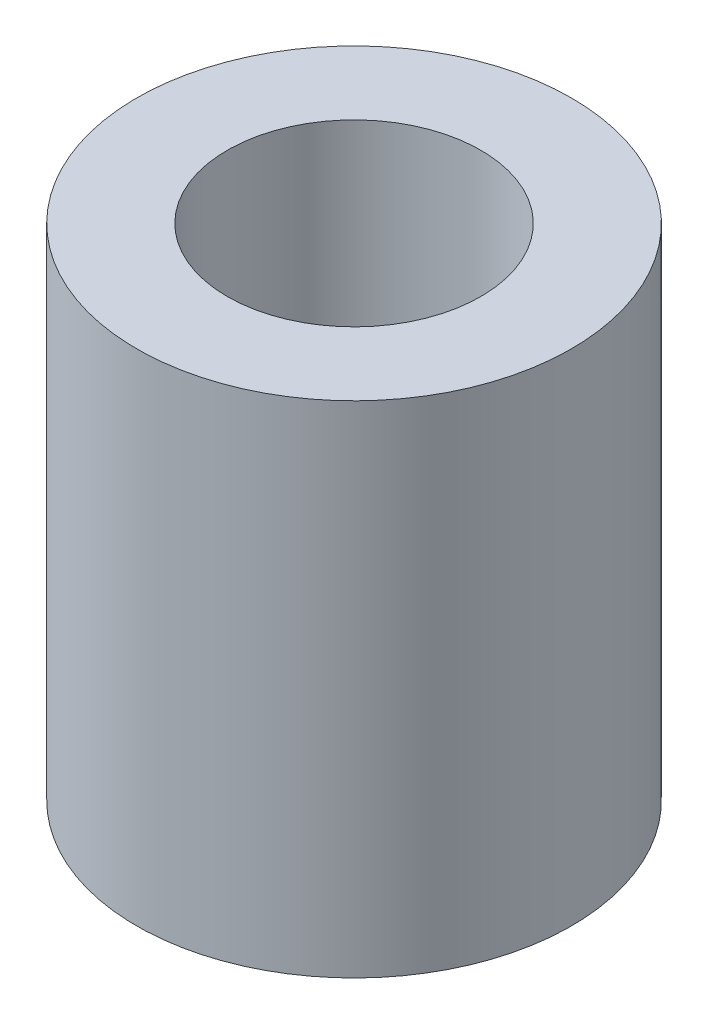
ISO-10303-21;
HEADER;
FILE_DESCRIPTION(('STEP AP214'),'2;1');
FILE_NAME('part.step','',(''),(''),'','','');
FILE_SCHEMA(('AUTOMOTIVE_DESIGN { 1 0 10303 214 1 1 1 1 }'));
ENDSEC;
DATA;
#1=APPLICATION_CONTEXT('core data for automotive mechanical design processes');
#2=APPLICATION_PROTOCOL_DEFINITION('international standard','automotive_design',2000,#1);
#3=PRODUCT_CONTEXT('',#1,'mechanical');
#4=PRODUCT('Part','Part','',(#3));
#5=PRODUCT_RELATED_PRODUCT_CATEGORY('part','',(#4));
#6=PRODUCT_DEFINITION_FORMATION('','',#4);
#7=PRODUCT_DEFINITION_CONTEXT('part definition',#1,'design');
#8=PRODUCT_DEFINITION('design','',#6,#7);
#9=PRODUCT_DEFINITION_SHAPE('','',#8);
#10=(LENGTH_UNIT() NAMED_UNIT(*) SI_UNIT(.MILLI.,.METRE.));
#11=(NAMED_UNIT(*) PLANE_ANGLE_UNIT() SI_UNIT($,.RADIAN.));
#12=(NAMED_UNIT(*) SI_UNIT($,.STERADIAN.) SOLID_ANGLE_UNIT());
#13=UNCERTAINTY_MEASURE_WITH_UNIT(LENGTH_MEASURE(1.E-05),#10,'distance_accuracy_value','');
#14=(GEOMETRIC_REPRESENTATION_CONTEXT(3) GLOBAL_UNCERTAINTY_ASSIGNED_CONTEXT((#13)) GLOBAL_UNIT_ASSIGNED_CONTEXT((#10,
#11,#12)) REPRESENTATION_CONTEXT('',''));
#15=CARTESIAN_POINT('',(0.,0.,0.));
#16=DIRECTION('',(0.,0.,1.));
#17=DIRECTION('',(1.,0.,0.));
#18=AXIS2_PLACEMENT_3D('',#15,#16,#17);
#19=CARTESIAN_POINT('',(0.,6.9,0.));
#20=DIRECTION('',(0.,-1.,0.));
#21=DIRECTION('',(0.,0.,-1.));
#22=AXIS2_PLACEMENT_3D('',#19,#20,#21);
#23=CYLINDRICAL_SURFACE('',#22,3.);
#24=CARTESIAN_POINT('',(0.,6.9,0.));
#25=DIRECTION('',(0.,1.,0.));
#26=DIRECTION('',(0.,0.,1.));
#27=AXIS2_PLACEMENT_3D('',#24,#25,#26);
#28=CIRCLE('',#27,3.);
#29=CARTESIAN_POINT('',(0.,6.9,-3.));
#30=VERTEX_POINT('',#29);
#31=EDGE_CURVE('E10',#30,#30,#28,.T.);
#32=CARTESIAN_POINT('',(0.,0.,0.));
#33=DIRECTION('',(0.,1.,0.));
#34=DIRECTION('',(0.,0.,1.));
#35=AXIS2_PLACEMENT_3D('',#32,#33,#34);
#36=CIRCLE('',#35,3.);
#37=CARTESIAN_POINT('',(0.,0.,-3.));
#38=VERTEX_POINT('',#37);
#39=EDGE_CURVE('E33',#38,#38,#36,.T.);
#40=CARTESIAN_POINT('',(0.,6.9,-3.));
#41=CARTESIAN_POINT('',(0.,6.828125,-3.));
#42=CARTESIAN_POINT('',(0.,6.75625,-3.));
#43=CARTESIAN_POINT('',(0.,6.6125,-3.));
#44=CARTESIAN_POINT('',(0.,6.540625,-3.));
#45=CARTESIAN_POINT('',(0.,6.396875,-3.));
#46=CARTESIAN_POINT('',(0.,6.325,-3.));
#47=CARTESIAN_POINT('',(0.,6.18125,-3.));
#48=CARTESIAN_POINT('',(0.,6.109375,-3.));
#49=CARTESIAN_POINT('',(0.,5.965625,-3.));
#50=CARTESIAN_POINT('',(0.,5.89375,-3.));
#51=CARTESIAN_POINT('',(0.,5.75,-3.));
#52=CARTESIAN_POINT('',(0.,5.678125,-3.));
#53=CARTESIAN_POINT('',(0.,5.534375,-3.));
#54=CARTESIAN_POINT('',(0.,5.4625,-3.));
#55=CARTESIAN_POINT('',(0.,5.31875,-3.));
#56=CARTESIAN_POINT('',(0.,5.246875,-3.));
#57=CARTESIAN_POINT('',(0.,5.103125,-3.));
#58=CARTESIAN_POINT('',(0.,5.03125,-3.));
#59=CARTESIAN_POINT('',(0.,4.8875,-3.));
#60=CARTESIAN_POINT('',(0.,4.815625,-3.));
#61=CARTESIAN_POINT('',(0.,4.671875,-3.));
#62=CARTESIAN_POINT('',(0.,4.6,-3.));
#63=CARTESIAN_POINT('',(0.,4.45625,-3.));
#64=CARTESIAN_POINT('',(0.,4.384375,-3.));
#65=CARTESIAN_POINT('',(0.,4.240625,-3.));
#66=CARTESIAN_POINT('',(0.,4.16875,-3.));
#67=CARTESIAN_POINT('',(0.,4.025,-3.));
#68=CARTESIAN_POINT('',(0.,3.953125,-3.));
#69=CARTESIAN_POINT('',(0.,3.809375,-3.));
#70=CARTESIAN_POINT('',(0.,3.7375,-3.));
#71=CARTESIAN_POINT('',(0.,3.59375,-3.));
#72=CARTESIAN_POINT('',(0.,3.521875,-3.));
#73=CARTESIAN_POINT('',(0.,3.378125,-3.));
#74=CARTESIAN_POINT('',(0.,3.30625,-3.));
#75=CARTESIAN_POINT('',(0.,3.1625,-3.));
#76=CARTESIAN_POINT('',(0.,3.090625,-3.));
#77=CARTESIAN_POINT('',(0.,2.946875,-3.));
#78=CARTESIAN_POINT('',(0.,2.875,-3.));
#79=CARTESIAN_POINT('',(0.,2.73125,-3.));
#80=CARTESIAN_POINT('',(0.,2.659375,-3.));
#81=CARTESIAN_POINT('',(0.,2.515625,-3.));
#82=CARTESIAN_POINT('',(0.,2.44375,-3.));
#83=CARTESIAN_POINT('',(0.,2.3,-3.));
#84=CARTESIAN_POINT('',(0.,2.228125,-3.));
#85=CARTESIAN_POINT('',(0.,2.084375,-3.));
#86=CARTESIAN_POINT('',(0.,2.0125,-3.));
#87=CARTESIAN_POINT('',(0.,1.86875,-3.));
#88=CARTESIAN_POINT('',(0.,1.796875,-3.));
#89=CARTESIAN_POINT('',(0.,1.653125,-3.));
#90=CARTESIAN_POINT('',(0.,1.58125,-3.));
#91=CARTESIAN_POINT('',(0.,1.4375,-3.));
#92=CARTESIAN_POINT('',(0.,1.365625,-3.));
#93=CARTESIAN_POINT('',(0.,1.221875,-3.));
#94=CARTESIAN_POINT('',(0.,1.15,-3.));
#95=CARTESIAN_POINT('',(0.,1.00625,-3.));
#96=CARTESIAN_POINT('',(0.,0.934375,-3.));
#97=CARTESIAN_POINT('',(0.,0.790625,-3.));
#98=CARTESIAN_POINT('',(0.,0.71875,-3.));
#99=CARTESIAN_POINT('',(0.,0.575,-3.));
#100=CARTESIAN_POINT('',(0.,0.503125,-3.));
#101=CARTESIAN_POINT('',(0.,0.359375,-3.));
#102=CARTESIAN_POINT('',(0.,0.2875,-3.));
#103=CARTESIAN_POINT('',(0.,0.14375,-3.));
#104=CARTESIAN_POINT('',(0.,0.0718749999999998,-3.));
#105=CARTESIAN_POINT('',(0.,0.,-3.));
#106=B_SPLINE_CURVE_WITH_KNOTS('',3,(#40,#41,#42,#43,#44,#45,#46,#47,#48,#49,#50,#51,#52,#53,
#54,#55,#56,#57,#58,#59,#60,#61,#62,#63,#64,#65,#66,#67,#68,#69,#70,#71,#72,#73,#74,#75,#76,#77,
#78,#79,#80,#81,#82,#83,#84,#85,#86,#87,#88,#89,#90,#91,#92,#93,#94,#95,#96,#97,#98,#99,#100,
#101,#102,#103,#104,#105),.UNSPECIFIED.,.F.,.F.,(4,2,2,2,2,2,2,2,2,2,2,2,2,2,2,2,2,2,2,2,2,2,2,
2,2,2,2,2,2,2,2,2,4),(0.,0.215625,0.431249999999999,0.646875,0.8625,1.078125,1.29375,1.509375,
1.725,1.940625,2.15625,2.371875,2.5875,2.803125,3.01875,3.234375,3.45,3.665625,3.88125,4.096875,
4.3125,4.528125,4.74375,4.959375,5.175,5.390625,5.60625,5.821875,6.0375,6.253125,6.46875,
6.684375,6.9),.UNSPECIFIED.);
#107=EDGE_CURVE('BSEAM30',#30,#38,#106,.T.);
#108=ORIENTED_EDGE('',*,*,#31,.F.);
#109=ORIENTED_EDGE('',*,*,#39,.T.);
#110=ORIENTED_EDGE('',*,*,#107,.T.);
#111=ORIENTED_EDGE('',*,*,#107,.F.);
#112=EDGE_LOOP('',(#108,#110,#109,#111));
#113=FACE_BOUND('',#112,.T.);
#114=ADVANCED_FACE('F30',(#113),#23,.T.);
#115=CARTESIAN_POINT('',(0.,6.9,0.));
#116=DIRECTION('',(0.,1.,0.));
#117=DIRECTION('',(0.,0.,1.));
#118=AXIS2_PLACEMENT_3D('',#115,#116,#117);
#119=PLANE('',#118);
#120=CARTESIAN_POINT('',(0.,6.9,0.));
#121=DIRECTION('',(0.,1.,0.));
#122=DIRECTION('',(0.,0.,1.));
#123=AXIS2_PLACEMENT_3D('',#120,#121,#122);
#124=CIRCLE('',#123,1.75);
#125=CARTESIAN_POINT('',(0.,6.9,1.75));
#126=VERTEX_POINT('',#125);
#127=EDGE_CURVE('E42',#126,#126,#124,.T.);
#128=ORIENTED_EDGE('',*,*,#127,.F.);
#129=EDGE_LOOP('',(#128));
#130=FACE_BOUND('',#129,.T.);
#131=ORIENTED_EDGE('',*,*,#31,.T.);
#132=EDGE_LOOP('',(#131));
#133=FACE_BOUND('',#132,.T.);
#134=ADVANCED_FACE('F57',(#130,#133),#119,.T.);
#135=CARTESIAN_POINT('',(0.,0.,0.));
#136=DIRECTION('',(0.,1.,0.));
#137=DIRECTION('',(0.,0.,1.));
#138=AXIS2_PLACEMENT_3D('',#135,#136,#137);
#139=PLANE('',#138);
#140=CARTESIAN_POINT('',(0.,0.,0.));
#141=DIRECTION('',(0.,1.,0.));
#142=DIRECTION('',(0.,0.,1.));
#143=AXIS2_PLACEMENT_3D('',#140,#141,#142);
#144=CIRCLE('',#143,1.75);
#145=CARTESIAN_POINT('',(0.,0.,1.75));
#146=VERTEX_POINT('',#145);
#147=EDGE_CURVE('E40',#146,#146,#144,.T.);
#148=ORIENTED_EDGE('',*,*,#147,.T.);
#149=EDGE_LOOP('',(#148));
#150=FACE_BOUND('',#149,.T.);
#151=ORIENTED_EDGE('',*,*,#39,.F.);
#152=EDGE_LOOP('',(#151));
#153=FACE_BOUND('',#152,.T.);
#154=ADVANCED_FACE('F48',(#150,#153),#139,.F.);
#155=CARTESIAN_POINT('',(0.,0.,0.));
#156=DIRECTION('',(0.,1.,0.));
#157=DIRECTION('',(0.,0.,1.));
#158=AXIS2_PLACEMENT_3D('',#155,#156,#157);
#159=CYLINDRICAL_SURFACE('',#158,1.75);
#160=CARTESIAN_POINT('',(0.,0.,1.75));
#161=CARTESIAN_POINT('',(0.,0.071875,1.75));
#162=CARTESIAN_POINT('',(0.,0.14375,1.75));
#163=CARTESIAN_POINT('',(0.,0.2875,1.75));
#164=CARTESIAN_POINT('',(0.,0.359375,1.75));
#165=CARTESIAN_POINT('',(0.,0.503125,1.75));
#166=CARTESIAN_POINT('',(0.,0.575,1.75));
#167=CARTESIAN_POINT('',(0.,0.71875,1.75));
#168=CARTESIAN_POINT('',(0.,0.790625,1.75));
#169=CARTESIAN_POINT('',(0.,0.934375,1.75));
#170=CARTESIAN_POINT('',(0.,1.00625,1.75));
#171=CARTESIAN_POINT('',(0.,1.15,1.75));
#172=CARTESIAN_POINT('',(0.,1.221875,1.75));
#173=CARTESIAN_POINT('',(0.,1.365625,1.75));
#174=CARTESIAN_POINT('',(0.,1.4375,1.75));
#175=CARTESIAN_POINT('',(0.,1.58125,1.75));
#176=CARTESIAN_POINT('',(0.,1.653125,1.75));
#177=CARTESIAN_POINT('',(0.,1.796875,1.75));
#178=CARTESIAN_POINT('',(0.,1.86875,1.75));
#179=CARTESIAN_POINT('',(0.,2.0125,1.75));
#180=CARTESIAN_POINT('',(0.,2.084375,1.75));
#181=CARTESIAN_POINT('',(0.,2.228125,1.75));
#182=CARTESIAN_POINT('',(0.,2.3,1.75));
#183=CARTESIAN_POINT('',(0.,2.44375,1.75));
#184=CARTESIAN_POINT('',(0.,2.515625,1.75));
#185=CARTESIAN_POINT('',(0.,2.659375,1.75));
#186=CARTESIAN_POINT('',(0.,2.73125,1.75));
#187=CARTESIAN_POINT('',(0.,2.875,1.75));
#188=CARTESIAN_POINT('',(0.,2.946875,1.75));
#189=CARTESIAN_POINT('',(0.,3.090625,1.75));
#190=CARTESIAN_POINT('',(0.,3.1625,1.75));
#191=CARTESIAN_POINT('',(0.,3.30625,1.75));
#192=CARTESIAN_POINT('',(0.,3.378125,1.75));
#193=CARTESIAN_POINT('',(0.,3.521875,1.75));
#194=CARTESIAN_POINT('',(0.,3.59375,1.75));
#195=CARTESIAN_POINT('',(0.,3.7375,1.75));
#196=CARTESIAN_POINT('',(0.,3.809375,1.75));
#197=CARTESIAN_POINT('',(0.,3.953125,1.75));
#198=CARTESIAN_POINT('',(0.,4.025,1.75));
#199=CARTESIAN_POINT('',(0.,4.16875,1.75));
#200=CARTESIAN_POINT('',(0.,4.240625,1.75));
#201=CARTESIAN_POINT('',(0.,4.384375,1.75));
#202=CARTESIAN_POINT('',(0.,4.45625,1.75));
#203=CARTESIAN_POINT('',(0.,4.6,1.75));
#204=CARTESIAN_POINT('',(0.,4.671875,1.75));
#205=CARTESIAN_POINT('',(0.,4.815625,1.75));
#206=CARTESIAN_POINT('',(0.,4.8875,1.75));
#207=CARTESIAN_POINT('',(0.,5.03125,1.75));
#208=CARTESIAN_POINT('',(0.,5.103125,1.75));
#209=CARTESIAN_POINT('',(0.,5.246875,1.75));
#210=CARTESIAN_POINT('',(0.,5.31875,1.75));
#211=CARTESIAN_POINT('',(0.,5.4625,1.75));
#212=CARTESIAN_POINT('',(0.,5.534375,1.75));
#213=CARTESIAN_POINT('',(0.,5.678125,1.75));
#214=CARTESIAN_POINT('',(0.,5.75,1.75));
#215=CARTESIAN_POINT('',(0.,5.89375,1.75));
#216=CARTESIAN_POINT('',(0.,5.965625,1.75));
#217=CARTESIAN_POINT('',(0.,6.109375,1.75));
#218=CARTESIAN_POINT('',(0.,6.18125,1.75));
#219=CARTESIAN_POINT('',(0.,6.325,1.75));
#220=CARTESIAN_POINT('',(0.,6.396875,1.75));
#221=CARTESIAN_POINT('',(0.,6.540625,1.75));
#222=CARTESIAN_POINT('',(0.,6.6125,1.75));
#223=CARTESIAN_POINT('',(0.,6.75625,1.75));
#224=CARTESIAN_POINT('',(0.,6.828125,1.75));
#225=CARTESIAN_POINT('',(0.,6.9,1.75));
#226=B_SPLINE_CURVE_WITH_KNOTS('',3,(#160,#161,#162,#163,#164,#165,#166,#167,#168,#169,#170,
#171,#172,#173,#174,#175,#176,#177,#178,#179,#180,#181,#182,#183,#184,#185,#186,#187,#188,#189,
#190,#191,#192,#193,#194,#195,#196,#197,#198,#199,#200,#201,#202,#203,#204,#205,#206,#207,#208,
#209,#210,#211,#212,#213,#214,#215,#216,#217,#218,#219,#220,#221,#222,#223,#224,#225),
.UNSPECIFIED.,.F.,.F.,(4,2,2,2,2,2,2,2,2,2,2,2,2,2,2,2,2,2,2,2,2,2,2,2,2,2,2,2,2,2,2,2,4),(0.,
0.215625,0.43125,0.646875,0.8625,1.078125,1.29375,1.509375,1.725,1.940625,2.15625,2.371875,
2.5875,2.803125,3.01875,3.234375,3.45,3.665625,3.88125,4.096875,4.3125,4.528125,4.74375,
4.959375,5.175,5.390625,5.60625,5.821875,6.0375,6.253125,6.46875,6.684375,6.9),.UNSPECIFIED.);
#227=EDGE_CURVE('BSEAM51',#146,#126,#226,.T.);
#228=ORIENTED_EDGE('',*,*,#147,.F.);
#229=ORIENTED_EDGE('',*,*,#127,.T.);
#230=ORIENTED_EDGE('',*,*,#227,.T.);
#231=ORIENTED_EDGE('',*,*,#227,.F.);
#232=EDGE_LOOP('',(#228,#230,#229,#231));
#233=FACE_BOUND('',#232,.T.);
#234=ADVANCED_FACE('F51',(#233),#159,.F.);
#235=CLOSED_SHELL('',(#114,#134,#154,#234));
#236=MANIFOLD_SOLID_BREP('B2',#235);
#237=ADVANCED_BREP_SHAPE_REPRESENTATION('',(#18,#236),#14);
#238=SHAPE_DEFINITION_REPRESENTATION(#9,#237);
ENDSEC;
END-ISO-10303-21;
